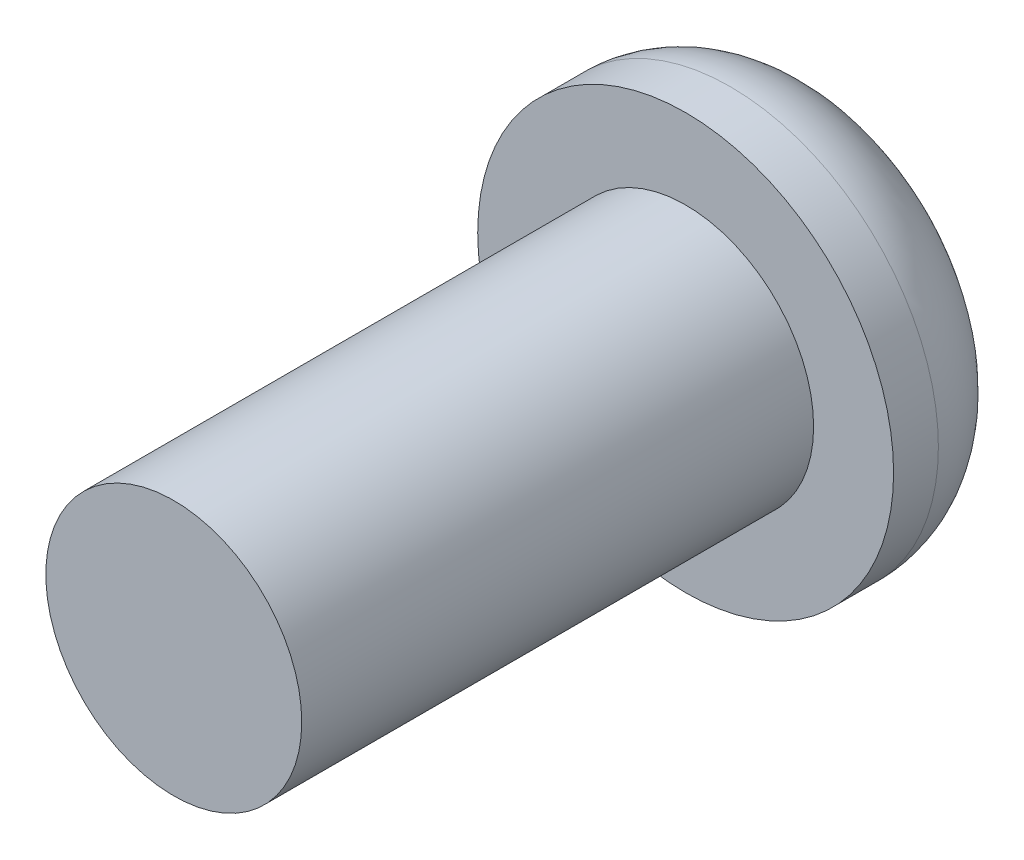
ISO-10303-21;
HEADER;
FILE_DESCRIPTION(('STEP AP214'),'2;1');
FILE_NAME('part.step','',(''),(''),'','','');
FILE_SCHEMA(('AUTOMOTIVE_DESIGN { 1 0 10303 214 1 1 1 1 }'));
ENDSEC;
DATA;
#1=APPLICATION_CONTEXT('core data for automotive mechanical design processes');
#2=APPLICATION_PROTOCOL_DEFINITION('international standard','automotive_design',2000,#1);
#3=PRODUCT_CONTEXT('',#1,'mechanical');
#4=PRODUCT('Part','Part','',(#3));
#5=PRODUCT_RELATED_PRODUCT_CATEGORY('part','',(#4));
#6=PRODUCT_DEFINITION_FORMATION('','',#4);
#7=PRODUCT_DEFINITION_CONTEXT('part definition',#1,'design');
#8=PRODUCT_DEFINITION('design','',#6,#7);
#9=PRODUCT_DEFINITION_SHAPE('','',#8);
#10=(LENGTH_UNIT() NAMED_UNIT(*) SI_UNIT(.MILLI.,.METRE.));
#11=(NAMED_UNIT(*) PLANE_ANGLE_UNIT() SI_UNIT($,.RADIAN.));
#12=(NAMED_UNIT(*) SI_UNIT($,.STERADIAN.) SOLID_ANGLE_UNIT());
#13=UNCERTAINTY_MEASURE_WITH_UNIT(LENGTH_MEASURE(1.E-05),#10,'distance_accuracy_value','');
#14=(GEOMETRIC_REPRESENTATION_CONTEXT(3) GLOBAL_UNCERTAINTY_ASSIGNED_CONTEXT((#13)) GLOBAL_UNIT_ASSIGNED_CONTEXT((#10,
#11,#12)) REPRESENTATION_CONTEXT('',''));
#15=CARTESIAN_POINT('',(0.,0.,0.));
#16=DIRECTION('',(0.,0.,1.));
#17=DIRECTION('',(1.,0.,0.));
#18=AXIS2_PLACEMENT_3D('',#15,#16,#17);
#19=CARTESIAN_POINT('',(0.,0.,8.));
#20=DIRECTION('',(0.,0.,-1.));
#21=DIRECTION('',(-1.,0.,0.));
#22=AXIS2_PLACEMENT_3D('',#19,#20,#21);
#23=CYLINDRICAL_SURFACE('',#22,2.);
#24=CARTESIAN_POINT('',(0.,0.,8.));
#25=DIRECTION('',(0.,0.,1.));
#26=DIRECTION('',(1.,0.,0.));
#27=AXIS2_PLACEMENT_3D('',#24,#25,#26);
#28=CIRCLE('',#27,2.);
#29=CARTESIAN_POINT('',(2.,0.,8.));
#30=VERTEX_POINT('',#29);
#31=EDGE_CURVE('E42',#30,#30,#28,.T.);
#32=ORIENTED_EDGE('',*,*,#31,.F.);
#33=EDGE_LOOP('',(#32));
#34=FACE_BOUND('',#33,.T.);
#35=CARTESIAN_POINT('',(0.,0.,0.));
#36=DIRECTION('',(0.,0.,1.));
#37=DIRECTION('',(1.,0.,0.));
#38=AXIS2_PLACEMENT_3D('',#35,#36,#37);
#39=CIRCLE('',#38,2.);
#40=CARTESIAN_POINT('',(2.,0.,0.));
#41=VERTEX_POINT('',#40);
#42=EDGE_CURVE('E46',#41,#41,#39,.T.);
#43=ORIENTED_EDGE('',*,*,#42,.T.);
#44=EDGE_LOOP('',(#43));
#45=FACE_BOUND('',#44,.T.);
#46=ADVANCED_FACE('F31',(#34,#45),#23,.T.);
#47=CARTESIAN_POINT('',(0.,0.,8.));
#48=DIRECTION('',(0.,0.,1.));
#49=DIRECTION('',(1.,0.,0.));
#50=AXIS2_PLACEMENT_3D('',#47,#48,#49);
#51=PLANE('',#50);
#52=ORIENTED_EDGE('',*,*,#31,.T.);
#53=EDGE_LOOP('',(#52));
#54=FACE_BOUND('',#53,.T.);
#55=ADVANCED_FACE('F71',(#54),#51,.T.);
#56=CARTESIAN_POINT('',(0.,0.,-2.2));
#57=DIRECTION('',(0.,0.,1.));
#58=DIRECTION('',(1.,0.,0.));
#59=AXIS2_PLACEMENT_3D('',#56,#57,#58);
#60=CYLINDRICAL_SURFACE('',#59,3.25);
#61=CARTESIAN_POINT('',(0.,0.,-0.7));
#62=DIRECTION('',(0.,0.,-1.));
#63=DIRECTION('',(-1.,0.,0.));
#64=AXIS2_PLACEMENT_3D('',#61,#62,#63);
#65=CIRCLE('',#64,3.25);
#66=CARTESIAN_POINT('',(-3.25,0.,-0.7));
#67=VERTEX_POINT('',#66);
#68=EDGE_CURVE('E10',#67,#67,#65,.F.);
#69=ORIENTED_EDGE('',*,*,#68,.T.);
#70=EDGE_LOOP('',(#69));
#71=FACE_BOUND('',#70,.T.);
#72=CARTESIAN_POINT('',(0.,0.,0.));
#73=DIRECTION('',(0.,0.,-1.));
#74=DIRECTION('',(-1.,0.,0.));
#75=AXIS2_PLACEMENT_3D('',#72,#73,#74);
#76=CIRCLE('',#75,3.25);
#77=CARTESIAN_POINT('',(-3.25,0.,0.));
#78=VERTEX_POINT('',#77);
#79=EDGE_CURVE('E50',#78,#78,#76,.T.);
#80=ORIENTED_EDGE('',*,*,#79,.T.);
#81=EDGE_LOOP('',(#80));
#82=FACE_BOUND('',#81,.T.);
#83=ADVANCED_FACE('F55',(#71,#82),#60,.T.);
#84=CARTESIAN_POINT('',(0.,0.,-2.2));
#85=DIRECTION('',(0.,0.,-1.));
#86=DIRECTION('',(-1.,0.,0.));
#87=AXIS2_PLACEMENT_3D('',#84,#85,#86);
#88=PLANE('',#87);
#89=CARTESIAN_POINT('',(0.,0.,-2.2));
#90=DIRECTION('',(0.,0.,-1.));
#91=DIRECTION('',(-1.,0.,0.));
#92=AXIS2_PLACEMENT_3D('',#89,#90,#91);
#93=CIRCLE('',#92,1.75);
#94=CARTESIAN_POINT('',(-1.75,0.,-2.2));
#95=VERTEX_POINT('',#94);
#96=EDGE_CURVE('E38',#95,#95,#93,.T.);
#97=ORIENTED_EDGE('',*,*,#96,.T.);
#98=EDGE_LOOP('',(#97));
#99=FACE_BOUND('',#98,.T.);
#100=ADVANCED_FACE('F59',(#99),#88,.T.);
#101=CARTESIAN_POINT('',(0.,0.,0.));
#102=DIRECTION('',(0.,0.,-1.));
#103=DIRECTION('',(-1.,0.,0.));
#104=AXIS2_PLACEMENT_3D('',#101,#102,#103);
#105=PLANE('',#104);
#106=ORIENTED_EDGE('',*,*,#42,.F.);
#107=EDGE_LOOP('',(#106));
#108=FACE_BOUND('',#107,.T.);
#109=ORIENTED_EDGE('',*,*,#79,.F.);
#110=EDGE_LOOP('',(#109));
#111=FACE_BOUND('',#110,.T.);
#112=ADVANCED_FACE('F57',(#108,#111),#105,.F.);
#113=CARTESIAN_POINT('',(0.,0.,-0.7));
#114=DIRECTION('',(0.,0.,-1.));
#115=DIRECTION('',(-1.,0.,0.));
#116=AXIS2_PLACEMENT_3D('',#113,#114,#115);
#117=TOROIDAL_SURFACE('',#116,1.75,1.5);
#118=ORIENTED_EDGE('',*,*,#68,.F.);
#119=EDGE_LOOP('',(#118));
#120=FACE_BOUND('',#119,.T.);
#121=ORIENTED_EDGE('',*,*,#96,.F.);
#122=EDGE_LOOP('',(#121));
#123=FACE_BOUND('',#122,.T.);
#124=ADVANCED_FACE('F33',(#120,#123),#117,.T.);
#125=CLOSED_SHELL('',(#46,#55,#83,#100,#112,#124));
#126=MANIFOLD_SOLID_BREP('B2',#125);
#127=ADVANCED_BREP_SHAPE_REPRESENTATION('',(#18,#126),#14);
#128=SHAPE_DEFINITION_REPRESENTATION(#9,#127);
ENDSEC;
END-ISO-10303-21;
